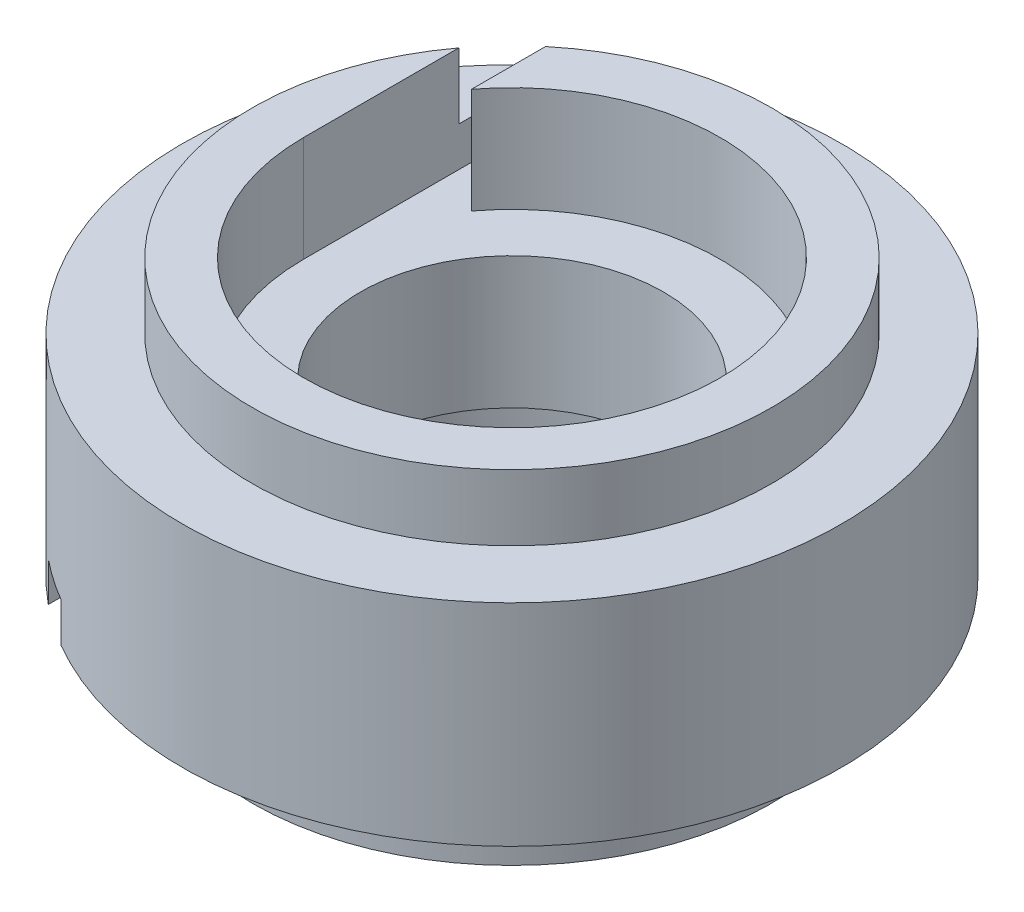
ISO-10303-21;
HEADER;
FILE_DESCRIPTION(('STEP AP214'),'2;1');
FILE_NAME('part.step','',(''),(''),'','','');
FILE_SCHEMA(('AUTOMOTIVE_DESIGN { 1 0 10303 214 1 1 1 1 }'));
ENDSEC;
DATA;
#1=APPLICATION_CONTEXT('core data for automotive mechanical design processes');
#2=APPLICATION_PROTOCOL_DEFINITION('international standard','automotive_design',2000,#1);
#3=PRODUCT_CONTEXT('',#1,'mechanical');
#4=PRODUCT('Part','Part','',(#3));
#5=PRODUCT_RELATED_PRODUCT_CATEGORY('part','',(#4));
#6=PRODUCT_DEFINITION_FORMATION('','',#4);
#7=PRODUCT_DEFINITION_CONTEXT('part definition',#1,'design');
#8=PRODUCT_DEFINITION('design','',#6,#7);
#9=PRODUCT_DEFINITION_SHAPE('','',#8);
#10=(LENGTH_UNIT() NAMED_UNIT(*) SI_UNIT(.MILLI.,.METRE.));
#11=(NAMED_UNIT(*) PLANE_ANGLE_UNIT() SI_UNIT($,.RADIAN.));
#12=(NAMED_UNIT(*) SI_UNIT($,.STERADIAN.) SOLID_ANGLE_UNIT());
#13=UNCERTAINTY_MEASURE_WITH_UNIT(LENGTH_MEASURE(1.E-05),#10,'distance_accuracy_value','');
#14=(GEOMETRIC_REPRESENTATION_CONTEXT(3) GLOBAL_UNCERTAINTY_ASSIGNED_CONTEXT((#13)) GLOBAL_UNIT_ASSIGNED_CONTEXT((#10,
#11,#12)) REPRESENTATION_CONTEXT('',''));
#15=CARTESIAN_POINT('',(0.,0.,0.));
#16=DIRECTION('',(0.,0.,1.));
#17=DIRECTION('',(1.,0.,0.));
#18=AXIS2_PLACEMENT_3D('',#15,#16,#17);
#19=CARTESIAN_POINT('',(0.,16.51,0.));
#20=DIRECTION('',(0.,-1.,0.));
#21=DIRECTION('',(0.,0.,-1.));
#22=AXIS2_PLACEMENT_3D('',#19,#20,#21);
#23=CYLINDRICAL_SURFACE('',#22,31.75);
#24=CARTESIAN_POINT('',(0.,10.16,0.));
#25=DIRECTION('',(0.,1.,0.));
#26=DIRECTION('',(0.,0.,1.));
#27=AXIS2_PLACEMENT_3D('',#24,#25,#26);
#28=CIRCLE('',#27,31.75);
#29=CARTESIAN_POINT('',(-20.066,10.16,-24.6052462698507));
#30=VERTEX_POINT('',#29);
#31=CARTESIAN_POINT('',(-16.002,10.16,-27.4225909789721));
#32=VERTEX_POINT('',#31);
#33=EDGE_CURVE('E172',#30,#32,#28,.T.);
#34=ORIENTED_EDGE('',*,*,#33,.F.);
#35=DIRECTION('',(0.,1.,0.));
#36=VECTOR('',#35,1.);
#37=CARTESIAN_POINT('',(-20.066,6.35,-24.6052462698507));
#38=LINE('',#37,#36);
#39=CARTESIAN_POINT('',(-20.066,6.35,-24.6052462698507));
#40=VERTEX_POINT('',#39);
#41=EDGE_CURVE('E204',#40,#30,#38,.T.);
#42=ORIENTED_EDGE('',*,*,#41,.F.);
#43=CARTESIAN_POINT('',(0.,6.35,0.));
#44=DIRECTION('',(0.,1.,0.));
#45=DIRECTION('',(0.,0.,1.));
#46=AXIS2_PLACEMENT_3D('',#43,#44,#45);
#47=CIRCLE('',#46,31.75);
#48=CARTESIAN_POINT('',(-16.002,6.35,-27.4225909789721));
#49=VERTEX_POINT('',#48);
#50=EDGE_CURVE('E188',#49,#40,#47,.T.);
#51=ORIENTED_EDGE('',*,*,#50,.F.);
#52=DIRECTION('',(0.,1.,0.));
#53=VECTOR('',#52,1.);
#54=CARTESIAN_POINT('',(-16.002,6.35,-27.4225909789721));
#55=LINE('',#54,#53);
#56=EDGE_CURVE('E207',#49,#32,#55,.T.);
#57=ORIENTED_EDGE('',*,*,#56,.T.);
#58=EDGE_LOOP('',(#34,#42,#51,#57));
#59=FACE_BOUND('',#58,.T.);
#60=CARTESIAN_POINT('',(0.,-10.16,0.));
#61=DIRECTION('',(0.,-1.,0.));
#62=DIRECTION('',(0.,0.,-1.));
#63=AXIS2_PLACEMENT_3D('',#60,#61,#62);
#64=CIRCLE('',#63,31.75);
#65=CARTESIAN_POINT('',(-20.066,-10.16,24.6052462698507));
#66=VERTEX_POINT('',#65);
#67=CARTESIAN_POINT('',(-16.002,-10.16,27.4225909789721));
#68=VERTEX_POINT('',#67);
#69=EDGE_CURVE('E128',#66,#68,#64,.T.);
#70=ORIENTED_EDGE('',*,*,#69,.F.);
#71=DIRECTION('',(0.,-1.,0.));
#72=VECTOR('',#71,1.);
#73=CARTESIAN_POINT('',(-20.066,-6.35,24.6052462698507));
#74=LINE('',#73,#72);
#75=CARTESIAN_POINT('',(-20.066,-6.35,24.6052462698507));
#76=VERTEX_POINT('',#75);
#77=EDGE_CURVE('E140',#76,#66,#74,.T.);
#78=ORIENTED_EDGE('',*,*,#77,.F.);
#79=CARTESIAN_POINT('',(0.,-6.35,0.));
#80=DIRECTION('',(0.,-1.,0.));
#81=DIRECTION('',(0.,0.,-1.));
#82=AXIS2_PLACEMENT_3D('',#79,#80,#81);
#83=CIRCLE('',#82,31.75);
#84=CARTESIAN_POINT('',(-16.002,-6.35,27.4225909789721));
#85=VERTEX_POINT('',#84);
#86=EDGE_CURVE('E153',#85,#76,#83,.T.);
#87=ORIENTED_EDGE('',*,*,#86,.F.);
#88=DIRECTION('',(0.,-1.,0.));
#89=VECTOR('',#88,1.);
#90=CARTESIAN_POINT('',(-16.002,-6.35,27.4225909789721));
#91=LINE('',#90,#89);
#92=EDGE_CURVE('E166',#85,#68,#91,.T.);
#93=ORIENTED_EDGE('',*,*,#92,.T.);
#94=EDGE_LOOP('',(#70,#78,#87,#93));
#95=FACE_BOUND('',#94,.T.);
#96=ADVANCED_FACE('F34',(#59,#95),#23,.T.);
#97=CARTESIAN_POINT('',(0.,-16.51,0.));
#98=DIRECTION('',(0.,1.,0.));
#99=DIRECTION('',(0.,0.,1.));
#100=AXIS2_PLACEMENT_3D('',#97,#98,#99);
#101=PLANE('',#100);
#102=CARTESIAN_POINT('',(0.,-16.51,0.));
#103=DIRECTION('',(0.,-1.,0.));
#104=DIRECTION('',(0.,0.,-1.));
#105=AXIS2_PLACEMENT_3D('',#102,#103,#104);
#106=CIRCLE('',#105,25.019);
#107=CARTESIAN_POINT('',(-20.066,-16.51,14.9434268158278));
#108=VERTEX_POINT('',#107);
#109=CARTESIAN_POINT('',(-16.002,-16.51,19.2324298256876));
#110=VERTEX_POINT('',#109);
#111=EDGE_CURVE('E123',#108,#110,#106,.T.);
#112=ORIENTED_EDGE('',*,*,#111,.T.);
#113=DIRECTION('',(0.,0.,1.));
#114=VECTOR('',#113,1.);
#115=CARTESIAN_POINT('',(-16.002,-16.51,12.107037292418));
#116=LINE('',#115,#114);
#117=CARTESIAN_POINT('',(-16.002,-16.51,12.107037292418));
#118=VERTEX_POINT('',#117);
#119=EDGE_CURVE('E142',#118,#110,#116,.T.);
#120=ORIENTED_EDGE('',*,*,#119,.F.);
#121=CARTESIAN_POINT('',(0.,-16.51,0.));
#122=DIRECTION('',(0.,-1.,0.));
#123=DIRECTION('',(0.,0.,-1.));
#124=AXIS2_PLACEMENT_3D('',#121,#122,#123);
#125=CIRCLE('',#124,20.066);
#126=CARTESIAN_POINT('',(-20.066,-16.51,0.));
#127=VERTEX_POINT('',#126);
#128=EDGE_CURVE('E55',#127,#118,#125,.T.);
#129=ORIENTED_EDGE('',*,*,#128,.F.);
#130=DIRECTION('',(0.,0.,-1.));
#131=VECTOR('',#130,1.);
#132=CARTESIAN_POINT('',(-20.066,-16.51,0.));
#133=LINE('',#132,#131);
#134=EDGE_CURVE('E150',#108,#127,#133,.T.);
#135=ORIENTED_EDGE('',*,*,#134,.F.);
#136=EDGE_LOOP('',(#112,#120,#129,#135));
#137=FACE_BOUND('',#136,.T.);
#138=ADVANCED_FACE('F222',(#137),#101,.F.);
#139=CARTESIAN_POINT('',(-20.066,-6.35,0.));
#140=DIRECTION('',(-1.,0.,0.));
#141=DIRECTION('',(0.,0.,1.));
#142=AXIS2_PLACEMENT_3D('',#139,#140,#141);
#143=PLANE('',#142);
#144=DIRECTION('',(0.,0.,1.));
#145=VECTOR('',#144,1.);
#146=CARTESIAN_POINT('',(-20.066,-10.16,0.));
#147=LINE('',#146,#145);
#148=CARTESIAN_POINT('',(-20.066,-10.16,14.9434268158278));
#149=VERTEX_POINT('',#148);
#150=EDGE_CURVE('E127',#149,#66,#147,.T.);
#151=ORIENTED_EDGE('',*,*,#150,.F.);
#152=DIRECTION('',(0.,-1.,0.));
#153=VECTOR('',#152,1.);
#154=CARTESIAN_POINT('',(-20.066,-10.16,14.9434268158278));
#155=LINE('',#154,#153);
#156=EDGE_CURVE('E120',#108,#149,#155,.F.);
#157=ORIENTED_EDGE('',*,*,#156,.F.);
#158=ORIENTED_EDGE('',*,*,#134,.T.);
#159=DIRECTION('',(0.,-1.,0.));
#160=VECTOR('',#159,1.);
#161=CARTESIAN_POINT('',(-20.066,-6.35,0.));
#162=LINE('',#161,#160);
#163=CARTESIAN_POINT('',(-20.066,-6.35,0.));
#164=VERTEX_POINT('',#163);
#165=EDGE_CURVE('E162',#164,#127,#162,.T.);
#166=ORIENTED_EDGE('',*,*,#165,.F.);
#167=DIRECTION('',(0.,0.,-1.));
#168=VECTOR('',#167,1.);
#169=CARTESIAN_POINT('',(-20.066,-6.35,0.));
#170=LINE('',#169,#168);
#171=EDGE_CURVE('E155',#76,#164,#170,.T.);
#172=ORIENTED_EDGE('',*,*,#171,.F.);
#173=ORIENTED_EDGE('',*,*,#77,.T.);
#174=EDGE_LOOP('',(#151,#157,#158,#166,#172,#173));
#175=FACE_BOUND('',#174,.T.);
#176=ADVANCED_FACE('F137',(#175),#143,.F.);
#177=CARTESIAN_POINT('',(-16.002,-6.35,12.107037292418));
#178=DIRECTION('',(1.,0.,0.));
#179=DIRECTION('',(0.,0.,-1.));
#180=AXIS2_PLACEMENT_3D('',#177,#178,#179);
#181=PLANE('',#180);
#182=DIRECTION('',(0.,0.,-1.));
#183=VECTOR('',#182,1.);
#184=CARTESIAN_POINT('',(-16.002,-10.16,12.107037292418));
#185=LINE('',#184,#183);
#186=CARTESIAN_POINT('',(-16.002,-10.16,19.2324298256876));
#187=VERTEX_POINT('',#186);
#188=EDGE_CURVE('E11',#68,#187,#185,.T.);
#189=ORIENTED_EDGE('',*,*,#188,.F.);
#190=ORIENTED_EDGE('',*,*,#92,.F.);
#191=DIRECTION('',(0.,0.,1.));
#192=VECTOR('',#191,1.);
#193=CARTESIAN_POINT('',(-16.002,-6.35,12.107037292418));
#194=LINE('',#193,#192);
#195=CARTESIAN_POINT('',(-16.002,-6.35,12.107037292418));
#196=VERTEX_POINT('',#195);
#197=EDGE_CURVE('E149',#196,#85,#194,.T.);
#198=ORIENTED_EDGE('',*,*,#197,.F.);
#199=DIRECTION('',(0.,-1.,0.));
#200=VECTOR('',#199,1.);
#201=CARTESIAN_POINT('',(-16.002,-6.35,12.107037292418));
#202=LINE('',#201,#200);
#203=EDGE_CURVE('E157',#196,#118,#202,.T.);
#204=ORIENTED_EDGE('',*,*,#203,.T.);
#205=ORIENTED_EDGE('',*,*,#119,.T.);
#206=DIRECTION('',(0.,-1.,0.));
#207=VECTOR('',#206,1.);
#208=CARTESIAN_POINT('',(-16.002,-10.16,19.2324298256876));
#209=LINE('',#208,#207);
#210=EDGE_CURVE('E41',#187,#110,#209,.T.);
#211=ORIENTED_EDGE('',*,*,#210,.F.);
#212=EDGE_LOOP('',(#189,#190,#198,#204,#205,#211));
#213=FACE_BOUND('',#212,.T.);
#214=ADVANCED_FACE('F224',(#213),#181,.F.);
#215=CARTESIAN_POINT('',(0.,16.51,0.));
#216=DIRECTION('',(0.,-1.,0.));
#217=DIRECTION('',(0.,0.,-1.));
#218=AXIS2_PLACEMENT_3D('',#215,#216,#217);
#219=CYLINDRICAL_SURFACE('',#218,14.605);
#220=CARTESIAN_POINT('',(0.,6.35,0.));
#221=DIRECTION('',(0.,1.,0.));
#222=DIRECTION('',(0.,0.,1.));
#223=AXIS2_PLACEMENT_3D('',#220,#221,#222);
#224=CIRCLE('',#223,14.605);
#225=CARTESIAN_POINT('',(0.,6.35,14.605));
#226=VERTEX_POINT('',#225);
#227=EDGE_CURVE('E203',#226,#226,#224,.T.);
#228=ORIENTED_EDGE('',*,*,#227,.T.);
#229=EDGE_LOOP('',(#228));
#230=FACE_BOUND('',#229,.T.);
#231=CARTESIAN_POINT('',(0.,-6.35,0.));
#232=DIRECTION('',(0.,-1.,0.));
#233=DIRECTION('',(0.,0.,-1.));
#234=AXIS2_PLACEMENT_3D('',#231,#232,#233);
#235=CIRCLE('',#234,14.605);
#236=CARTESIAN_POINT('',(0.,-6.35,-14.605));
#237=VERTEX_POINT('',#236);
#238=EDGE_CURVE('E164',#237,#237,#235,.T.);
#239=ORIENTED_EDGE('',*,*,#238,.T.);
#240=EDGE_LOOP('',(#239));
#241=FACE_BOUND('',#240,.T.);
#242=ADVANCED_FACE('F277',(#230,#241),#219,.F.);
#243=CARTESIAN_POINT('',(0.,16.51,0.));
#244=DIRECTION('',(0.,1.,0.));
#245=DIRECTION('',(0.,0.,1.));
#246=AXIS2_PLACEMENT_3D('',#243,#244,#245);
#247=PLANE('',#246);
#248=DIRECTION('',(0.,0.,1.));
#249=VECTOR('',#248,1.);
#250=CARTESIAN_POINT('',(-20.066,16.51,0.));
#251=LINE('',#250,#249);
#252=CARTESIAN_POINT('',(-20.066,16.51,-14.9434268158278));
#253=VERTEX_POINT('',#252);
#254=CARTESIAN_POINT('',(-20.066,16.51,0.));
#255=VERTEX_POINT('',#254);
#256=EDGE_CURVE('E186',#253,#255,#251,.T.);
#257=ORIENTED_EDGE('',*,*,#256,.F.);
#258=CARTESIAN_POINT('',(0.,16.51,0.));
#259=DIRECTION('',(0.,1.,0.));
#260=DIRECTION('',(0.,0.,1.));
#261=AXIS2_PLACEMENT_3D('',#258,#259,#260);
#262=CIRCLE('',#261,25.019);
#263=CARTESIAN_POINT('',(-16.002,16.51,-19.2324298256876));
#264=VERTEX_POINT('',#263);
#265=EDGE_CURVE('E173',#253,#264,#262,.T.);
#266=ORIENTED_EDGE('',*,*,#265,.T.);
#267=DIRECTION('',(0.,0.,-1.));
#268=VECTOR('',#267,1.);
#269=CARTESIAN_POINT('',(-16.002,16.51,-12.107037292418));
#270=LINE('',#269,#268);
#271=CARTESIAN_POINT('',(-16.002,16.51,-12.107037292418));
#272=VERTEX_POINT('',#271);
#273=EDGE_CURVE('E196',#272,#264,#270,.T.);
#274=ORIENTED_EDGE('',*,*,#273,.F.);
#275=CARTESIAN_POINT('',(0.,16.51,0.));
#276=DIRECTION('',(0.,1.,0.));
#277=DIRECTION('',(0.,0.,1.));
#278=AXIS2_PLACEMENT_3D('',#275,#276,#277);
#279=CIRCLE('',#278,20.066);
#280=EDGE_CURVE('E181',#255,#272,#279,.T.);
#281=ORIENTED_EDGE('',*,*,#280,.F.);
#282=EDGE_LOOP('',(#257,#266,#274,#281));
#283=FACE_BOUND('',#282,.T.);
#284=ADVANCED_FACE('F262',(#283),#247,.T.);
#285=CARTESIAN_POINT('',(-20.066,6.35,0.));
#286=DIRECTION('',(-1.,0.,0.));
#287=DIRECTION('',(0.,0.,1.));
#288=AXIS2_PLACEMENT_3D('',#285,#286,#287);
#289=PLANE('',#288);
#290=DIRECTION('',(0.,0.,-1.));
#291=VECTOR('',#290,1.);
#292=CARTESIAN_POINT('',(-20.066,10.16,0.));
#293=LINE('',#292,#291);
#294=CARTESIAN_POINT('',(-20.066,10.16,-14.9434268158278));
#295=VERTEX_POINT('',#294);
#296=EDGE_CURVE('E179',#295,#30,#293,.T.);
#297=ORIENTED_EDGE('',*,*,#296,.F.);
#298=DIRECTION('',(0.,1.,0.));
#299=VECTOR('',#298,1.);
#300=CARTESIAN_POINT('',(-20.066,10.16,-14.9434268158278));
#301=LINE('',#300,#299);
#302=EDGE_CURVE('E177',#253,#295,#301,.F.);
#303=ORIENTED_EDGE('',*,*,#302,.F.);
#304=ORIENTED_EDGE('',*,*,#256,.T.);
#305=DIRECTION('',(0.,1.,0.));
#306=VECTOR('',#305,1.);
#307=CARTESIAN_POINT('',(-20.066,6.35,0.));
#308=LINE('',#307,#306);
#309=CARTESIAN_POINT('',(-20.066,6.35,0.));
#310=VERTEX_POINT('',#309);
#311=EDGE_CURVE('E200',#310,#255,#308,.T.);
#312=ORIENTED_EDGE('',*,*,#311,.F.);
#313=DIRECTION('',(0.,0.,1.));
#314=VECTOR('',#313,1.);
#315=CARTESIAN_POINT('',(-20.066,6.35,0.));
#316=LINE('',#315,#314);
#317=EDGE_CURVE('E190',#40,#310,#316,.T.);
#318=ORIENTED_EDGE('',*,*,#317,.F.);
#319=ORIENTED_EDGE('',*,*,#41,.T.);
#320=EDGE_LOOP('',(#297,#303,#304,#312,#318,#319));
#321=FACE_BOUND('',#320,.T.);
#322=ADVANCED_FACE('F246',(#321),#289,.F.);
#323=CARTESIAN_POINT('',(-16.002,6.35,-12.107037292418));
#324=DIRECTION('',(1.,0.,0.));
#325=DIRECTION('',(0.,0.,-1.));
#326=AXIS2_PLACEMENT_3D('',#323,#324,#325);
#327=PLANE('',#326);
#328=DIRECTION('',(0.,0.,1.));
#329=VECTOR('',#328,1.);
#330=CARTESIAN_POINT('',(-16.002,10.16,-12.107037292418));
#331=LINE('',#330,#329);
#332=CARTESIAN_POINT('',(-16.002,10.16,-19.2324298256876));
#333=VERTEX_POINT('',#332);
#334=EDGE_CURVE('E215',#32,#333,#331,.T.);
#335=ORIENTED_EDGE('',*,*,#334,.F.);
#336=ORIENTED_EDGE('',*,*,#56,.F.);
#337=DIRECTION('',(0.,0.,-1.));
#338=VECTOR('',#337,1.);
#339=CARTESIAN_POINT('',(-16.002,6.35,-12.107037292418));
#340=LINE('',#339,#338);
#341=CARTESIAN_POINT('',(-16.002,6.35,-12.107037292418));
#342=VERTEX_POINT('',#341);
#343=EDGE_CURVE('E185',#342,#49,#340,.T.);
#344=ORIENTED_EDGE('',*,*,#343,.F.);
#345=DIRECTION('',(0.,1.,0.));
#346=VECTOR('',#345,1.);
#347=CARTESIAN_POINT('',(-16.002,6.35,-12.107037292418));
#348=LINE('',#347,#346);
#349=EDGE_CURVE('E193',#342,#272,#348,.T.);
#350=ORIENTED_EDGE('',*,*,#349,.T.);
#351=ORIENTED_EDGE('',*,*,#273,.T.);
#352=DIRECTION('',(0.,1.,0.));
#353=VECTOR('',#352,1.);
#354=CARTESIAN_POINT('',(-16.002,10.16,-19.2324298256876));
#355=LINE('',#354,#353);
#356=EDGE_CURVE('E213',#333,#264,#355,.T.);
#357=ORIENTED_EDGE('',*,*,#356,.F.);
#358=EDGE_LOOP('',(#335,#336,#344,#350,#351,#357));
#359=FACE_BOUND('',#358,.T.);
#360=ADVANCED_FACE('F253',(#359),#327,.F.);
#361=CARTESIAN_POINT('',(0.,6.35,0.));
#362=DIRECTION('',(0.,1.,0.));
#363=DIRECTION('',(0.,0.,1.));
#364=AXIS2_PLACEMENT_3D('',#361,#362,#363);
#365=CYLINDRICAL_SURFACE('',#364,20.066);
#366=ORIENTED_EDGE('',*,*,#280,.T.);
#367=ORIENTED_EDGE('',*,*,#349,.F.);
#368=CARTESIAN_POINT('',(0.,6.35,0.));
#369=DIRECTION('',(0.,1.,0.));
#370=DIRECTION('',(0.,0.,1.));
#371=AXIS2_PLACEMENT_3D('',#368,#369,#370);
#372=CIRCLE('',#371,20.066);
#373=EDGE_CURVE('E182',#310,#342,#372,.T.);
#374=ORIENTED_EDGE('',*,*,#373,.F.);
#375=ORIENTED_EDGE('',*,*,#311,.T.);
#376=EDGE_LOOP('',(#366,#367,#374,#375));
#377=FACE_BOUND('',#376,.T.);
#378=ADVANCED_FACE('F265',(#377),#365,.F.);
#379=CARTESIAN_POINT('',(0.,6.35,0.));
#380=DIRECTION('',(0.,1.,0.));
#381=DIRECTION('',(0.,0.,1.));
#382=AXIS2_PLACEMENT_3D('',#379,#380,#381);
#383=PLANE('',#382);
#384=ORIENTED_EDGE('',*,*,#227,.F.);
#385=EDGE_LOOP('',(#384));
#386=FACE_BOUND('',#385,.T.);
#387=ORIENTED_EDGE('',*,*,#373,.T.);
#388=ORIENTED_EDGE('',*,*,#343,.T.);
#389=ORIENTED_EDGE('',*,*,#50,.T.);
#390=ORIENTED_EDGE('',*,*,#317,.T.);
#391=EDGE_LOOP('',(#387,#388,#389,#390));
#392=FACE_BOUND('',#391,.T.);
#393=ADVANCED_FACE('F250',(#386,#392),#383,.T.);
#394=CARTESIAN_POINT('',(0.,10.16,0.));
#395=DIRECTION('',(0.,1.,0.));
#396=DIRECTION('',(0.,0.,1.));
#397=AXIS2_PLACEMENT_3D('',#394,#395,#396);
#398=PLANE('',#397);
#399=ORIENTED_EDGE('',*,*,#296,.T.);
#400=ORIENTED_EDGE('',*,*,#33,.T.);
#401=ORIENTED_EDGE('',*,*,#334,.T.);
#402=CARTESIAN_POINT('',(0.,10.16,0.));
#403=DIRECTION('',(0.,1.,0.));
#404=DIRECTION('',(0.,0.,1.));
#405=AXIS2_PLACEMENT_3D('',#402,#403,#404);
#406=CIRCLE('',#405,25.019);
#407=EDGE_CURVE('E170',#295,#333,#406,.T.);
#408=ORIENTED_EDGE('',*,*,#407,.F.);
#409=EDGE_LOOP('',(#399,#400,#401,#408));
#410=FACE_BOUND('',#409,.T.);
#411=ADVANCED_FACE('F256',(#410),#398,.T.);
#412=CARTESIAN_POINT('',(0.,10.16,0.));
#413=DIRECTION('',(0.,1.,0.));
#414=DIRECTION('',(0.,0.,1.));
#415=AXIS2_PLACEMENT_3D('',#412,#413,#414);
#416=CYLINDRICAL_SURFACE('',#415,25.019);
#417=ORIENTED_EDGE('',*,*,#302,.T.);
#418=ORIENTED_EDGE('',*,*,#407,.T.);
#419=ORIENTED_EDGE('',*,*,#356,.T.);
#420=ORIENTED_EDGE('',*,*,#265,.F.);
#421=EDGE_LOOP('',(#417,#418,#419,#420));
#422=FACE_BOUND('',#421,.T.);
#423=ADVANCED_FACE('F258',(#422),#416,.T.);
#424=CARTESIAN_POINT('',(0.,-6.35,0.));
#425=DIRECTION('',(0.,-1.,0.));
#426=DIRECTION('',(0.,0.,-1.));
#427=AXIS2_PLACEMENT_3D('',#424,#425,#426);
#428=CYLINDRICAL_SURFACE('',#427,20.066);
#429=ORIENTED_EDGE('',*,*,#128,.T.);
#430=ORIENTED_EDGE('',*,*,#203,.F.);
#431=CARTESIAN_POINT('',(0.,-6.35,0.));
#432=DIRECTION('',(0.,-1.,0.));
#433=DIRECTION('',(0.,0.,-1.));
#434=AXIS2_PLACEMENT_3D('',#431,#432,#433);
#435=CIRCLE('',#434,20.066);
#436=EDGE_CURVE('E146',#164,#196,#435,.T.);
#437=ORIENTED_EDGE('',*,*,#436,.F.);
#438=ORIENTED_EDGE('',*,*,#165,.T.);
#439=EDGE_LOOP('',(#429,#430,#437,#438));
#440=FACE_BOUND('',#439,.T.);
#441=ADVANCED_FACE('F227',(#440),#428,.F.);
#442=CARTESIAN_POINT('',(0.,-6.35,0.));
#443=DIRECTION('',(0.,-1.,0.));
#444=DIRECTION('',(0.,0.,-1.));
#445=AXIS2_PLACEMENT_3D('',#442,#443,#444);
#446=PLANE('',#445);
#447=ORIENTED_EDGE('',*,*,#238,.F.);
#448=EDGE_LOOP('',(#447));
#449=FACE_BOUND('',#448,.T.);
#450=ORIENTED_EDGE('',*,*,#436,.T.);
#451=ORIENTED_EDGE('',*,*,#197,.T.);
#452=ORIENTED_EDGE('',*,*,#86,.T.);
#453=ORIENTED_EDGE('',*,*,#171,.T.);
#454=EDGE_LOOP('',(#450,#451,#452,#453));
#455=FACE_BOUND('',#454,.T.);
#456=ADVANCED_FACE('F229',(#449,#455),#446,.T.);
#457=CARTESIAN_POINT('',(0.,-10.16,0.));
#458=DIRECTION('',(0.,-1.,0.));
#459=DIRECTION('',(0.,0.,-1.));
#460=AXIS2_PLACEMENT_3D('',#457,#458,#459);
#461=PLANE('',#460);
#462=ORIENTED_EDGE('',*,*,#150,.T.);
#463=ORIENTED_EDGE('',*,*,#69,.T.);
#464=ORIENTED_EDGE('',*,*,#188,.T.);
#465=CARTESIAN_POINT('',(0.,-10.16,0.));
#466=DIRECTION('',(0.,-1.,0.));
#467=DIRECTION('',(0.,0.,-1.));
#468=AXIS2_PLACEMENT_3D('',#465,#466,#467);
#469=CIRCLE('',#468,25.019);
#470=EDGE_CURVE('E48',#149,#187,#469,.T.);
#471=ORIENTED_EDGE('',*,*,#470,.F.);
#472=EDGE_LOOP('',(#462,#463,#464,#471));
#473=FACE_BOUND('',#472,.T.);
#474=ADVANCED_FACE('F131',(#473),#461,.T.);
#475=CARTESIAN_POINT('',(0.,-10.16,0.));
#476=DIRECTION('',(0.,-1.,0.));
#477=DIRECTION('',(0.,0.,-1.));
#478=AXIS2_PLACEMENT_3D('',#475,#476,#477);
#479=CYLINDRICAL_SURFACE('',#478,25.019);
#480=ORIENTED_EDGE('',*,*,#156,.T.);
#481=ORIENTED_EDGE('',*,*,#470,.T.);
#482=ORIENTED_EDGE('',*,*,#210,.T.);
#483=ORIENTED_EDGE('',*,*,#111,.F.);
#484=EDGE_LOOP('',(#480,#481,#482,#483));
#485=FACE_BOUND('',#484,.T.);
#486=ADVANCED_FACE('F121',(#485),#479,.T.);
#487=CLOSED_SHELL('',(#96,#138,#176,#214,#242,#284,#322,#360,#378,#393,#411,#423,#441,#456,#474,#486));
#488=MANIFOLD_SOLID_BREP('B2',#487);
#489=ADVANCED_BREP_SHAPE_REPRESENTATION('',(#18,#488),#14);
#490=SHAPE_DEFINITION_REPRESENTATION(#9,#489);
ENDSEC;
END-ISO-10303-21;
